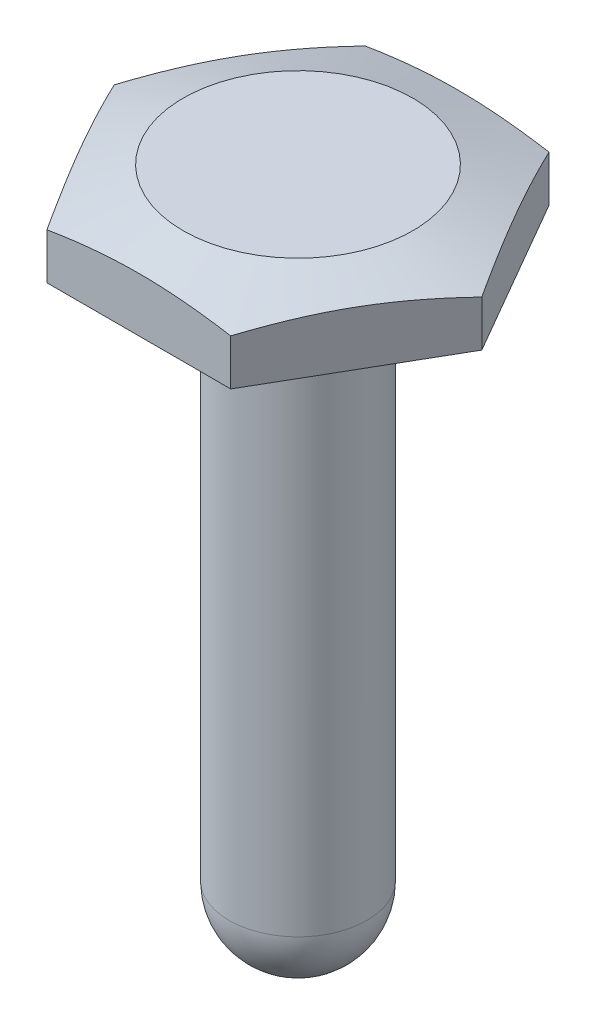
ISO-10303-21;
HEADER;
FILE_DESCRIPTION(('STEP AP214'),'2;1');
FILE_NAME('part.step','',(''),(''),'','','');
FILE_SCHEMA(('AUTOMOTIVE_DESIGN { 1 0 10303 214 1 1 1 1 }'));
ENDSEC;
DATA;
#1=APPLICATION_CONTEXT('core data for automotive mechanical design processes');
#2=APPLICATION_PROTOCOL_DEFINITION('international standard','automotive_design',2000,#1);
#3=PRODUCT_CONTEXT('',#1,'mechanical');
#4=PRODUCT('Part','Part','',(#3));
#5=PRODUCT_RELATED_PRODUCT_CATEGORY('part','',(#4));
#6=PRODUCT_DEFINITION_FORMATION('','',#4);
#7=PRODUCT_DEFINITION_CONTEXT('part definition',#1,'design');
#8=PRODUCT_DEFINITION('design','',#6,#7);
#9=PRODUCT_DEFINITION_SHAPE('','',#8);
#10=(LENGTH_UNIT() NAMED_UNIT(*) SI_UNIT(.MILLI.,.METRE.));
#11=(NAMED_UNIT(*) PLANE_ANGLE_UNIT() SI_UNIT($,.RADIAN.));
#12=(NAMED_UNIT(*) SI_UNIT($,.STERADIAN.) SOLID_ANGLE_UNIT());
#13=UNCERTAINTY_MEASURE_WITH_UNIT(LENGTH_MEASURE(1.E-05),#10,'distance_accuracy_value','');
#14=(GEOMETRIC_REPRESENTATION_CONTEXT(3) GLOBAL_UNCERTAINTY_ASSIGNED_CONTEXT((#13)) GLOBAL_UNIT_ASSIGNED_CONTEXT((#10,
#11,#12)) REPRESENTATION_CONTEXT('',''));
#15=CARTESIAN_POINT('',(0.,0.,0.));
#16=DIRECTION('',(0.,0.,1.));
#17=DIRECTION('',(1.,0.,0.));
#18=AXIS2_PLACEMENT_3D('',#15,#16,#17);
#19=CARTESIAN_POINT('',(9.52500000000007,-9.525,0.));
#20=DIRECTION('',(0.,1.,0.));
#21=DIRECTION('',(0.,0.,1.));
#22=AXIS2_PLACEMENT_3D('',#19,#20,#21);
#23=PLANE('',#22);
#24=CARTESIAN_POINT('',(0.,-9.525,0.));
#25=DIRECTION('',(0.,1.,0.));
#26=DIRECTION('',(0.,0.,1.));
#27=AXIS2_PLACEMENT_3D('',#24,#25,#26);
#28=CIRCLE('',#27,9.52500000000007);
#29=CARTESIAN_POINT('',(0.,-9.525,9.52500000000007));
#30=VERTEX_POINT('',#29);
#31=EDGE_CURVE('E141',#30,#30,#28,.T.);
#32=ORIENTED_EDGE('',*,*,#31,.T.);
#33=EDGE_LOOP('',(#32));
#34=FACE_BOUND('',#33,.T.);
#35=DIRECTION('',(0.5,0.,-0.866025403784439));
#36=VECTOR('',#35,1.);
#37=CARTESIAN_POINT('',(21.43125,-9.525,6.87407664253896));
#38=LINE('',#37,#36);
#39=CARTESIAN_POINT('',(12.7,-9.52500000000001,21.9970452561247));
#40=VERTEX_POINT('',#39);
#41=CARTESIAN_POINT('',(25.4,-9.525,0.));
#42=VERTEX_POINT('',#41);
#43=EDGE_CURVE('E134',#40,#42,#38,.T.);
#44=ORIENTED_EDGE('',*,*,#43,.F.);
#45=DIRECTION('',(1.,0.,0.));
#46=VECTOR('',#45,1.);
#47=CARTESIAN_POINT('',(9.52500000000007,-9.525,21.9970452561247));
#48=LINE('',#47,#46);
#49=CARTESIAN_POINT('',(-12.7,-9.52500000000001,21.9970452561247));
#50=VERTEX_POINT('',#49);
#51=EDGE_CURVE('E131',#50,#40,#48,.T.);
#52=ORIENTED_EDGE('',*,*,#51,.F.);
#53=DIRECTION('',(0.5,0.,0.866025403784439));
#54=VECTOR('',#53,1.);
#55=CARTESIAN_POINT('',(-16.66875,-9.525,15.1229686135858));
#56=LINE('',#55,#54);
#57=CARTESIAN_POINT('',(-25.4,-9.52500000000001,0.));
#58=VERTEX_POINT('',#57);
#59=EDGE_CURVE('E125',#58,#50,#56,.T.);
#60=ORIENTED_EDGE('',*,*,#59,.F.);
#61=DIRECTION('',(-0.5,0.,0.866025403784439));
#62=VECTOR('',#61,1.);
#63=CARTESIAN_POINT('',(-16.66875,-9.525,-15.1229686135858));
#64=LINE('',#63,#62);
#65=CARTESIAN_POINT('',(-12.7,-9.52500000000001,-21.9970452561247));
#66=VERTEX_POINT('',#65);
#67=EDGE_CURVE('E121',#66,#58,#64,.T.);
#68=ORIENTED_EDGE('',*,*,#67,.F.);
#69=DIRECTION('',(-1.,0.,0.));
#70=VECTOR('',#69,1.);
#71=CARTESIAN_POINT('',(9.52500000000007,-9.525,-21.9970452561247));
#72=LINE('',#71,#70);
#73=CARTESIAN_POINT('',(12.7,-9.52500000000001,-21.9970452561247));
#74=VERTEX_POINT('',#73);
#75=EDGE_CURVE('E106',#74,#66,#72,.T.);
#76=ORIENTED_EDGE('',*,*,#75,.F.);
#77=DIRECTION('',(-0.5,0.,-0.866025403784438));
#78=VECTOR('',#77,1.);
#79=CARTESIAN_POINT('',(21.43125,-9.525,-6.87407664253896));
#80=LINE('',#79,#78);
#81=EDGE_CURVE('E100',#42,#74,#80,.T.);
#82=ORIENTED_EDGE('',*,*,#81,.F.);
#83=EDGE_LOOP('',(#44,#52,#60,#68,#76,#82));
#84=FACE_BOUND('',#83,.T.);
#85=ADVANCED_FACE('F44',(#34,#84),#23,.F.);
#86=CARTESIAN_POINT('',(0.,-85.725,0.));
#87=DIRECTION('',(0.,1.,0.));
#88=DIRECTION('',(-1.,0.,0.));
#89=AXIS2_PLACEMENT_3D('',#86,#87,#88);
#90=SPHERICAL_SURFACE('',#89,9.525);
#91=CARTESIAN_POINT('',(0.,-85.725,0.));
#92=DIRECTION('',(0.,1.,0.));
#93=DIRECTION('',(0.,0.,1.));
#94=AXIS2_PLACEMENT_3D('',#91,#92,#93);
#95=CIRCLE('',#94,9.52500000000007);
#96=CARTESIAN_POINT('',(0.,-85.725,9.52500000000007));
#97=VERTEX_POINT('',#96);
#98=EDGE_CURVE('E145',#97,#97,#95,.T.);
#99=ORIENTED_EDGE('',*,*,#98,.F.);
#100=EDGE_LOOP('',(#99));
#101=FACE_BOUND('',#100,.T.);
#102=ADVANCED_FACE('F183',(#101),#90,.T.);
#103=CARTESIAN_POINT('',(0.,0.,0.));
#104=DIRECTION('',(0.,1.,0.));
#105=DIRECTION('',(0.,0.,1.));
#106=AXIS2_PLACEMENT_3D('',#103,#104,#105);
#107=CYLINDRICAL_SURFACE('',#106,9.52500000000007);
#108=ORIENTED_EDGE('',*,*,#31,.F.);
#109=EDGE_LOOP('',(#108));
#110=FACE_BOUND('',#109,.T.);
#111=ORIENTED_EDGE('',*,*,#98,.T.);
#112=EDGE_LOOP('',(#111));
#113=FACE_BOUND('',#112,.T.);
#114=ADVANCED_FACE('F174',(#110,#113),#107,.T.);
#115=CARTESIAN_POINT('',(12.7,-95.25,21.9970452561247));
#116=DIRECTION('',(0.866025403784439,0.,0.5));
#117=DIRECTION('',(0.5,0.,-0.866025403784439));
#118=AXIS2_PLACEMENT_3D('',#115,#116,#117);
#119=PLANE('',#118);
#120=ORIENTED_EDGE('',*,*,#43,.T.);
#121=DIRECTION('',(0.,1.,0.));
#122=VECTOR('',#121,1.);
#123=CARTESIAN_POINT('',(25.4,-95.25,0.));
#124=LINE('',#123,#122);
#125=CARTESIAN_POINT('',(25.4,-3.175,0.));
#126=VERTEX_POINT('',#125);
#127=EDGE_CURVE('E66',#42,#126,#124,.T.);
#128=ORIENTED_EDGE('',*,*,#127,.T.);
#129=CARTESIAN_POINT('',(25.4001154700538,-3.17503849028041,-0.000199999999997387));
#130=CARTESIAN_POINT('',(25.1368562649023,-3.0872913287684,0.455778318882641));
#131=CARTESIAN_POINT('',(24.8732704860666,-3.00351543960742,0.912322279978701));
#132=CARTESIAN_POINT('',(24.3454172361454,-2.84476326196486,1.82659092778261));
#133=CARTESIAN_POINT('',(24.0811497129611,-2.76978766766134,2.28431570472813));
#134=CARTESIAN_POINT('',(23.2870421118456,-2.5592869942159,3.65975041653684));
#135=CARTESIAN_POINT('',(22.7561974047889,-2.43829013567412,4.57920042008807));
#136=CARTESIAN_POINT('',(21.9604933898794,-2.29118213104087,5.95740020169796));
#137=CARTESIAN_POINT('',(21.6964032374505,-2.24798198811961,6.41481776348342));
#138=CARTESIAN_POINT('',(21.1678089575893,-2.1733908711785,7.3303699127932));
#139=CARTESIAN_POINT('',(20.9033048446129,-2.1419994936375,7.78850447527935));
#140=CARTESIAN_POINT('',(20.374076809069,-2.09156074710856,8.70515432163111));
#141=CARTESIAN_POINT('',(20.1093529695522,-2.07250989861226,9.16366946164903));
#142=CARTESIAN_POINT('',(19.5797527530954,-2.04707041728609,10.0809639442517));
#143=CARTESIAN_POINT('',(19.3148763765477,-2.04068175204158,10.539743286157));
#144=CARTESIAN_POINT('',(18.7851236234523,-2.04068175204158,11.4573019699677));
#145=CARTESIAN_POINT('',(18.5202472469046,-2.04707041728609,11.9160813118731));
#146=CARTESIAN_POINT('',(17.9906470304478,-2.07250989861226,12.8333757944757));
#147=CARTESIAN_POINT('',(17.725923190931,-2.09156074710856,13.2918909344936));
#148=CARTESIAN_POINT('',(17.1966951553871,-2.1419994936375,14.2085407808454));
#149=CARTESIAN_POINT('',(16.9321910424107,-2.1733908711785,14.6666753433315));
#150=CARTESIAN_POINT('',(16.4035967625495,-2.24798198811961,15.5822274926413));
#151=CARTESIAN_POINT('',(16.1395066101206,-2.29118213104087,16.0396450544268));
#152=CARTESIAN_POINT('',(15.3438025952111,-2.43829013567412,17.4178448360367));
#153=CARTESIAN_POINT('',(14.8129578881544,-2.5592869942159,18.3372948395879));
#154=CARTESIAN_POINT('',(14.0188502870389,-2.76978766766134,19.7127295513966));
#155=CARTESIAN_POINT('',(13.7545827638546,-2.84476326196486,20.1704543283421));
#156=CARTESIAN_POINT('',(13.2267295139334,-3.00351543960742,21.084722976146));
#157=CARTESIAN_POINT('',(12.9631437350977,-3.0872913287684,21.5412669372421));
#158=CARTESIAN_POINT('',(12.6998845299462,-3.17503849028041,21.9972452561247));
#159=B_SPLINE_CURVE_WITH_KNOTS('',3,(#129,#130,#131,#132,#133,#134,#135,#136,#137,#138,#139,
#140,#141,#142,#143,#144,#145,#146,#147,#148,#149,#150,#151,#152,#153,#154,#155,#156,#157,#158),
.UNSPECIFIED.,.F.,.F.,(4,2,2,2,2,2,2,2,2,2,2,2,2,2,4),(0.,1.60130008237788,3.2027263925052,
6.40740635069926,7.99713308911825,9.58680549953178,11.1760294940916,12.7652494203022,
14.3544693465127,15.9436933410725,17.5333657514861,19.123092489905,22.3277724480991,
23.9291987582264,25.5304988406043),.UNSPECIFIED.);
#160=CARTESIAN_POINT('',(12.7,-3.175,21.9970452561247));
#161=VERTEX_POINT('',#160);
#162=EDGE_CURVE('E12',#126,#161,#159,.T.);
#163=ORIENTED_EDGE('',*,*,#162,.T.);
#164=DIRECTION('',(0.,1.,0.));
#165=VECTOR('',#164,1.);
#166=CARTESIAN_POINT('',(12.7,-95.25,21.9970452561247));
#167=LINE('',#166,#165);
#168=EDGE_CURVE('E107',#40,#161,#167,.T.);
#169=ORIENTED_EDGE('',*,*,#168,.F.);
#170=EDGE_LOOP('',(#120,#128,#163,#169));
#171=FACE_BOUND('',#170,.T.);
#172=ADVANCED_FACE('F170',(#171),#119,.T.);
#173=CARTESIAN_POINT('',(-12.7,-95.25,21.9970452561247));
#174=DIRECTION('',(0.,0.,1.));
#175=DIRECTION('',(1.,0.,0.));
#176=AXIS2_PLACEMENT_3D('',#173,#174,#175);
#177=PLANE('',#176);
#178=ORIENTED_EDGE('',*,*,#51,.T.);
#179=ORIENTED_EDGE('',*,*,#168,.T.);
#180=CARTESIAN_POINT('',(38.2978683508479,-9.43018678027433,21.9970452561247));
#181=CARTESIAN_POINT('',(37.366954446028,-9.16114723012989,21.9970452561247));
#182=CARTESIAN_POINT('',(36.4354054698626,-8.89428263096763,21.9970452561247));
#183=CARTESIAN_POINT('',(34.570766140768,-8.36590793195759,21.9970452561247));
#184=CARTESIAN_POINT('',(33.6376757499567,-8.10439796588751,21.9970452561247));
#185=CARTESIAN_POINT('',(31.7694417135726,-7.58767125656107,21.9970452561247));
#186=CARTESIAN_POINT('',(30.8342975250424,-7.33245647237417,21.9970452561247));
#187=CARTESIAN_POINT('',(28.9619399416782,-6.82973732138097,21.9970452561247));
#188=CARTESIAN_POINT('',(28.0247265572278,-6.5822329159763,21.9970452561247));
#189=CARTESIAN_POINT('',(26.1343112374944,-6.0930792131876,21.9970452561247));
#190=CARTESIAN_POINT('',(25.1810739435313,-5.85156618217118,21.9970452561247));
#191=CARTESIAN_POINT('',(23.2716684198158,-5.38035570374151,21.9970452561247));
#192=CARTESIAN_POINT('',(22.3155001770607,-5.15065830882682,21.9970452561247));
#193=CARTESIAN_POINT('',(20.3995985687122,-4.70578347297172,21.9970452561247));
#194=CARTESIAN_POINT('',(19.4398646046469,-4.49060859750058,21.9970452561247));
#195=CARTESIAN_POINT('',(17.5165183701394,-4.07823880539323,21.9970452561247));
#196=CARTESIAN_POINT('',(16.5529061075321,-3.88104385245313,21.9970452561247));
#197=CARTESIAN_POINT('',(14.6606963079455,-3.5163777410803,21.9970452561247));
#198=CARTESIAN_POINT('',(13.732270198692,-3.34802337716021,21.9970452561247));
#199=CARTESIAN_POINT('',(11.8712391455674,-3.0359965524344,21.9970452561247));
#200=CARTESIAN_POINT('',(10.9386342031952,-2.89232408277724,21.9970452561247));
#201=CARTESIAN_POINT('',(9.0697522509864,-2.63443440999201,21.9970452561247));
#202=CARTESIAN_POINT('',(8.13347714635197,-2.5202035668261,21.9970452561247));
#203=CARTESIAN_POINT('',(6.25736787790616,-2.32578734686945,21.9970452561247));
#204=CARTESIAN_POINT('',(5.31753379809013,-2.24560117158126,21.9970452561247));
#205=CARTESIAN_POINT('',(3.44166070609843,-2.12359572466948,21.9970452561247));
#206=CARTESIAN_POINT('',(2.50563844811313,-2.08152302829441,21.9970452561247));
#207=CARTESIAN_POINT('',(0.632639422870756,-2.03710415764205,21.9970452561247));
#208=CARTESIAN_POINT('',(-0.304337338287472,-2.03475773110452,21.9970452561247));
#209=CARTESIAN_POINT('',(-2.17767826259224,-2.06992521958852,21.9970452561247));
#210=CARTESIAN_POINT('',(-3.11404230145292,-2.10744561183136,21.9970452561247));
#211=CARTESIAN_POINT('',(-4.98445913479629,-2.22031210036118,21.9970452561247));
#212=CARTESIAN_POINT('',(-5.91851192826693,-2.29565821320835,21.9970452561247));
#213=CARTESIAN_POINT('',(-7.50860972863141,-2.45325306589533,21.9970452561247));
#214=CARTESIAN_POINT('',(-8.1655261893116,-2.52693585185173,21.9970452561247));
#215=CARTESIAN_POINT('',(-9.47740727682041,-2.68970655765212,21.9970452561247));
#216=CARTESIAN_POINT('',(-10.1323719866191,-2.77879381285834,21.9970452561247));
#217=CARTESIAN_POINT('',(-12.0940944371739,-3.06667409413572,21.9970452561247));
#218=CARTESIAN_POINT('',(-13.3978493418652,-3.28610319992141,21.9970452561247));
#219=CARTESIAN_POINT('',(-15.3505278038922,-3.64772557242004,21.9970452561247));
#220=CARTESIAN_POINT('',(-16.0025019847754,-3.77402470233867,21.9970452561247));
#221=CARTESIAN_POINT('',(-17.3045720728078,-4.03600182379453,21.9970452561247));
#222=CARTESIAN_POINT('',(-17.9546679859193,-4.17167978552482,21.9970452561247));
#223=CARTESIAN_POINT('',(-19.2530861244948,-4.45116923630007,21.9970452561247));
#224=CARTESIAN_POINT('',(-19.9014083845156,-4.59498056567828,21.9970452561247));
#225=CARTESIAN_POINT('',(-21.1964500005815,-4.88966491700774,21.9970452561247));
#226=CARTESIAN_POINT('',(-21.8431693410121,-5.04053800746738,21.9970452561247));
#227=CARTESIAN_POINT('',(-23.1553223519192,-5.3532168249874,21.9970452561247));
#228=CARTESIAN_POINT('',(-23.8207096400034,-5.51521683518905,21.9970452561247));
#229=CARTESIAN_POINT('',(-25.1500867986151,-5.84485912760692,21.9970452561247));
#230=CARTESIAN_POINT('',(-25.8140766589831,-6.01250145069373,21.9970452561247));
#231=CARTESIAN_POINT('',(-27.8041798316898,-6.52273756253639,21.9970452561247));
#232=CARTESIAN_POINT('',(-29.128422328909,-6.87263943276859,21.9970452561247));
#233=CARTESIAN_POINT('',(-31.1063344789276,-7.40709912856073,21.9970452561247));
#234=CARTESIAN_POINT('',(-31.7615226451943,-7.5860895358468,21.9970452561247));
#235=CARTESIAN_POINT('',(-33.0710170527472,-7.94727720245181,21.9970452561247));
#236=CARTESIAN_POINT('',(-33.7253232927207,-8.12947446653824,21.9970452561247));
#237=CARTESIAN_POINT('',(-35.0330794980826,-8.49666349655702,21.9970452561247));
#238=CARTESIAN_POINT('',(-35.6865295423757,-8.68165498191825,21.9970452561247));
#239=CARTESIAN_POINT('',(-36.9927143425478,-9.05413065189059,21.9970452561247));
#240=CARTESIAN_POINT('',(-37.6454491031381,-9.24161481997544,21.9970452561247));
#241=CARTESIAN_POINT('',(-38.2978683508479,-9.43018678027433,21.9970452561247));
#242=B_SPLINE_CURVE_WITH_KNOTS('',3,(#180,#181,#182,#183,#184,#185,#186,#187,#188,#189,#190,
#191,#192,#193,#194,#195,#196,#197,#198,#199,#200,#201,#202,#203,#204,#205,#206,#207,#208,#209,
#210,#211,#212,#213,#214,#215,#216,#217,#218,#219,#220,#221,#222,#223,#224,#225,#226,#227,#228,
#229,#230,#231,#232,#233,#234,#235,#236,#237,#238,#239,#240,#241),.UNSPECIFIED.,.F.,.F.,(4,2,2,
2,2,2,2,2,2,2,2,2,2,2,2,2,2,2,2,2,2,2,2,2,2,2,2,2,2,2,4),(0.,2.90704069307795,5.81415392593051,
8.72216072497131,11.6301529641093,14.5801613357166,17.5301828135015,20.4807240693313,
23.43125936749,26.2616866158578,29.0921128491729,31.9212254050207,34.7502716020497,
37.5603657647112,40.3704420833796,43.1809750291471,45.9915092053745,47.9744318829263,
49.9572690270767,53.922434494936,55.9146802895544,57.9069197528939,59.8991201199987,
61.8913398180826,63.9457836311217,66.0002423289037,70.1091733210494,72.1467614182709,
74.1843525449374,76.2217404170812,78.2591147882679),.UNSPECIFIED.);
#243=CARTESIAN_POINT('',(-12.7,-3.175,21.9970452561247));
#244=VERTEX_POINT('',#243);
#245=EDGE_CURVE('E59',#161,#244,#242,.T.);
#246=ORIENTED_EDGE('',*,*,#245,.T.);
#247=DIRECTION('',(0.,1.,0.));
#248=VECTOR('',#247,1.);
#249=CARTESIAN_POINT('',(-12.7,-95.25,21.9970452561247));
#250=LINE('',#249,#248);
#251=EDGE_CURVE('E301',#50,#244,#250,.T.);
#252=ORIENTED_EDGE('',*,*,#251,.F.);
#253=EDGE_LOOP('',(#178,#179,#246,#252));
#254=FACE_BOUND('',#253,.T.);
#255=ADVANCED_FACE('F173',(#254),#177,.T.);
#256=CARTESIAN_POINT('',(-25.4,-95.25,0.));
#257=DIRECTION('',(-0.866025403784439,0.,0.5));
#258=DIRECTION('',(0.5,0.,0.866025403784439));
#259=AXIS2_PLACEMENT_3D('',#256,#257,#258);
#260=PLANE('',#259);
#261=ORIENTED_EDGE('',*,*,#59,.T.);
#262=ORIENTED_EDGE('',*,*,#251,.T.);
#263=CARTESIAN_POINT('',(-12.6998845299462,-3.17503849028041,21.9972452561247));
#264=CARTESIAN_POINT('',(-12.9631437350977,-3.0872913287684,21.5412669372421));
#265=CARTESIAN_POINT('',(-13.2267295139334,-3.00351543960742,21.084722976146));
#266=CARTESIAN_POINT('',(-13.7545827638546,-2.84476326196486,20.1704543283421));
#267=CARTESIAN_POINT('',(-14.0188502870389,-2.76978766766134,19.7127295513966));
#268=CARTESIAN_POINT('',(-14.8129578881544,-2.5592869942159,18.3372948395879));
#269=CARTESIAN_POINT('',(-15.3438025952111,-2.43829013567412,17.4178448360367));
#270=CARTESIAN_POINT('',(-16.1395066101206,-2.29118213104087,16.0396450544268));
#271=CARTESIAN_POINT('',(-16.4035967625495,-2.24798198811961,15.5822274926413));
#272=CARTESIAN_POINT('',(-16.9321910424107,-2.1733908711785,14.6666753433315));
#273=CARTESIAN_POINT('',(-17.1966951553871,-2.14199949363749,14.2085407808454));
#274=CARTESIAN_POINT('',(-17.725923190931,-2.09156074710856,13.2918909344936));
#275=CARTESIAN_POINT('',(-17.9906470304478,-2.07250989861226,12.8333757944757));
#276=CARTESIAN_POINT('',(-18.5202472469046,-2.04707041728609,11.9160813118731));
#277=CARTESIAN_POINT('',(-18.7851236234523,-2.04068175204158,11.4573019699677));
#278=CARTESIAN_POINT('',(-19.3148763765477,-2.04068175204158,10.539743286157));
#279=CARTESIAN_POINT('',(-19.5797527530954,-2.04707041728609,10.0809639442517));
#280=CARTESIAN_POINT('',(-20.1093529695522,-2.07250989861226,9.16366946164903));
#281=CARTESIAN_POINT('',(-20.374076809069,-2.09156074710856,8.7051543216311));
#282=CARTESIAN_POINT('',(-20.9033048446129,-2.1419994936375,7.78850447527935));
#283=CARTESIAN_POINT('',(-21.1678089575893,-2.1733908711785,7.33036991279319));
#284=CARTESIAN_POINT('',(-21.6964032374505,-2.24798198811961,6.41481776348342));
#285=CARTESIAN_POINT('',(-21.9604933898794,-2.29118213104087,5.95740020169795));
#286=CARTESIAN_POINT('',(-22.7561974047889,-2.43829013567412,4.57920042008806));
#287=CARTESIAN_POINT('',(-23.2870421118456,-2.5592869942159,3.65975041653684));
#288=CARTESIAN_POINT('',(-24.0811497129611,-2.76978766766134,2.28431570472812));
#289=CARTESIAN_POINT('',(-24.3454172361454,-2.84476326196486,1.8265909277826));
#290=CARTESIAN_POINT('',(-24.8732704860666,-3.00351543960742,0.912322279978691));
#291=CARTESIAN_POINT('',(-25.1368562649023,-3.0872913287684,0.455778318882629));
#292=CARTESIAN_POINT('',(-25.4001154700538,-3.17503849028041,-0.000200000000010062));
#293=B_SPLINE_CURVE_WITH_KNOTS('',3,(#263,#264,#265,#266,#267,#268,#269,#270,#271,#272,#273,
#274,#275,#276,#277,#278,#279,#280,#281,#282,#283,#284,#285,#286,#287,#288,#289,#290,#291,#292),
.UNSPECIFIED.,.F.,.F.,(4,2,2,2,2,2,2,2,2,2,2,2,2,2,4),(0.,1.60130008237787,3.2027263925052,
6.40740635069926,7.99713308911826,9.58680549953178,11.1760294940916,12.7652494203022,
14.3544693465128,15.9436933410725,17.5333657514861,19.1230924899051,22.3277724480991,
23.9291987582264,25.5304988406043),.UNSPECIFIED.);
#294=CARTESIAN_POINT('',(-25.4,-3.175,0.));
#295=VERTEX_POINT('',#294);
#296=EDGE_CURVE('E316',#244,#295,#293,.T.);
#297=ORIENTED_EDGE('',*,*,#296,.T.);
#298=DIRECTION('',(0.,1.,0.));
#299=VECTOR('',#298,1.);
#300=CARTESIAN_POINT('',(-25.4,-95.25,0.));
#301=LINE('',#300,#299);
#302=EDGE_CURVE('E304',#58,#295,#301,.T.);
#303=ORIENTED_EDGE('',*,*,#302,.F.);
#304=EDGE_LOOP('',(#261,#262,#297,#303));
#305=FACE_BOUND('',#304,.T.);
#306=ADVANCED_FACE('F180',(#305),#260,.T.);
#307=CARTESIAN_POINT('',(-12.7,-95.25,-21.9970452561247));
#308=DIRECTION('',(-0.866025403784439,0.,-0.5));
#309=DIRECTION('',(-0.5,0.,0.866025403784439));
#310=AXIS2_PLACEMENT_3D('',#307,#308,#309);
#311=PLANE('',#310);
#312=ORIENTED_EDGE('',*,*,#67,.T.);
#313=ORIENTED_EDGE('',*,*,#302,.T.);
#314=CARTESIAN_POINT('',(-25.4001154700538,-3.17503849028041,0.000199999999993958));
#315=CARTESIAN_POINT('',(-25.1368562649023,-3.0872913287684,-0.455778318882644));
#316=CARTESIAN_POINT('',(-24.8732704860666,-3.00351543960742,-0.912322279978704));
#317=CARTESIAN_POINT('',(-24.3454172361454,-2.84476326196486,-1.82659092778262));
#318=CARTESIAN_POINT('',(-24.0811497129611,-2.76978766766134,-2.28431570472813));
#319=CARTESIAN_POINT('',(-23.2870421118456,-2.5592869942159,-3.65975041653685));
#320=CARTESIAN_POINT('',(-22.7561974047889,-2.43829013567412,-4.57920042008807));
#321=CARTESIAN_POINT('',(-21.9604933898794,-2.29118213104087,-5.95740020169796));
#322=CARTESIAN_POINT('',(-21.6964032374505,-2.24798198811961,-6.41481776348342));
#323=CARTESIAN_POINT('',(-21.1678089575893,-2.1733908711785,-7.3303699127932));
#324=CARTESIAN_POINT('',(-20.9033048446129,-2.1419994936375,-7.78850447527936));
#325=CARTESIAN_POINT('',(-20.374076809069,-2.09156074710856,-8.70515432163111));
#326=CARTESIAN_POINT('',(-20.1093529695522,-2.07250989861226,-9.16366946164904));
#327=CARTESIAN_POINT('',(-19.5797527530954,-2.04707041728609,-10.0809639442517));
#328=CARTESIAN_POINT('',(-19.3148763765477,-2.04068175204158,-10.539743286157));
#329=CARTESIAN_POINT('',(-18.7851236234523,-2.04068175204158,-11.4573019699677));
#330=CARTESIAN_POINT('',(-18.5202472469046,-2.04707041728609,-11.9160813118731));
#331=CARTESIAN_POINT('',(-17.9906470304478,-2.07250989861226,-12.8333757944757));
#332=CARTESIAN_POINT('',(-17.725923190931,-2.09156074710856,-13.2918909344936));
#333=CARTESIAN_POINT('',(-17.1966951553871,-2.1419994936375,-14.2085407808454));
#334=CARTESIAN_POINT('',(-16.9321910424107,-2.1733908711785,-14.6666753433315));
#335=CARTESIAN_POINT('',(-16.4035967625495,-2.24798198811961,-15.5822274926413));
#336=CARTESIAN_POINT('',(-16.1395066101206,-2.29118213104087,-16.0396450544268));
#337=CARTESIAN_POINT('',(-15.3438025952111,-2.43829013567412,-17.4178448360367));
#338=CARTESIAN_POINT('',(-14.8129578881544,-2.5592869942159,-18.3372948395879));
#339=CARTESIAN_POINT('',(-14.0188502870389,-2.76978766766134,-19.7127295513966));
#340=CARTESIAN_POINT('',(-13.7545827638546,-2.84476326196486,-20.1704543283421));
#341=CARTESIAN_POINT('',(-13.2267295139334,-3.00351543960742,-21.084722976146));
#342=CARTESIAN_POINT('',(-12.9631437350977,-3.0872913287684,-21.5412669372421));
#343=CARTESIAN_POINT('',(-12.6998845299462,-3.17503849028041,-21.9972452561247));
#344=B_SPLINE_CURVE_WITH_KNOTS('',3,(#314,#315,#316,#317,#318,#319,#320,#321,#322,#323,#324,
#325,#326,#327,#328,#329,#330,#331,#332,#333,#334,#335,#336,#337,#338,#339,#340,#341,#342,#343),
.UNSPECIFIED.,.F.,.F.,(4,2,2,2,2,2,2,2,2,2,2,2,2,2,4),(0.,1.60130008237788,3.2027263925052,
6.40740635069926,7.99713308911825,9.58680549953178,11.1760294940916,12.7652494203022,
14.3544693465128,15.9436933410725,17.5333657514861,19.1230924899051,22.3277724480991,
23.9291987582264,25.5304988406043),.UNSPECIFIED.);
#345=CARTESIAN_POINT('',(-12.7,-3.175,-21.9970452561247));
#346=VERTEX_POINT('',#345);
#347=EDGE_CURVE('E313',#295,#346,#344,.T.);
#348=ORIENTED_EDGE('',*,*,#347,.T.);
#349=DIRECTION('',(0.,1.,0.));
#350=VECTOR('',#349,1.);
#351=CARTESIAN_POINT('',(-12.7,-95.25,-21.9970452561247));
#352=LINE('',#351,#350);
#353=EDGE_CURVE('E117',#66,#346,#352,.T.);
#354=ORIENTED_EDGE('',*,*,#353,.F.);
#355=EDGE_LOOP('',(#312,#313,#348,#354));
#356=FACE_BOUND('',#355,.T.);
#357=ADVANCED_FACE('F230',(#356),#311,.T.);
#358=CARTESIAN_POINT('',(12.7,-95.25,-21.9970452561247));
#359=DIRECTION('',(0.,0.,-1.));
#360=DIRECTION('',(-1.,0.,0.));
#361=AXIS2_PLACEMENT_3D('',#358,#359,#360);
#362=PLANE('',#361);
#363=ORIENTED_EDGE('',*,*,#75,.T.);
#364=ORIENTED_EDGE('',*,*,#353,.T.);
#365=CARTESIAN_POINT('',(-38.2978683508479,-9.43018678027433,-21.9970452561247));
#366=CARTESIAN_POINT('',(-37.366954446028,-9.16114723012989,-21.9970452561247));
#367=CARTESIAN_POINT('',(-36.4354054698626,-8.89428263096763,-21.9970452561247));
#368=CARTESIAN_POINT('',(-34.570766140768,-8.36590793195759,-21.9970452561247));
#369=CARTESIAN_POINT('',(-33.6376757499567,-8.10439796588751,-21.9970452561247));
#370=CARTESIAN_POINT('',(-31.7694417135726,-7.58767125656107,-21.9970452561247));
#371=CARTESIAN_POINT('',(-30.8342975250424,-7.33245647237417,-21.9970452561247));
#372=CARTESIAN_POINT('',(-28.9619399416782,-6.82973732138098,-21.9970452561247));
#373=CARTESIAN_POINT('',(-28.0247265572279,-6.5822329159763,-21.9970452561247));
#374=CARTESIAN_POINT('',(-26.1343112374944,-6.0930792131876,-21.9970452561247));
#375=CARTESIAN_POINT('',(-25.1810739435313,-5.85156618217119,-21.9970452561247));
#376=CARTESIAN_POINT('',(-23.2716684198158,-5.38035570374152,-21.9970452561247));
#377=CARTESIAN_POINT('',(-22.3155001770607,-5.15065830882683,-21.9970452561247));
#378=CARTESIAN_POINT('',(-20.3995985687122,-4.70578347297172,-21.9970452561247));
#379=CARTESIAN_POINT('',(-19.4398646046469,-4.49060859750058,-21.9970452561247));
#380=CARTESIAN_POINT('',(-17.5165183701394,-4.07823880539323,-21.9970452561247));
#381=CARTESIAN_POINT('',(-16.5529061075321,-3.88104385245313,-21.9970452561247));
#382=CARTESIAN_POINT('',(-14.6606963079455,-3.5163777410803,-21.9970452561247));
#383=CARTESIAN_POINT('',(-13.732270198692,-3.34802337716021,-21.9970452561247));
#384=CARTESIAN_POINT('',(-11.8712391455674,-3.0359965524344,-21.9970452561247));
#385=CARTESIAN_POINT('',(-10.9386342031952,-2.89232408277724,-21.9970452561247));
#386=CARTESIAN_POINT('',(-9.0697522509864,-2.63443440999201,-21.9970452561247));
#387=CARTESIAN_POINT('',(-8.13347714635197,-2.5202035668261,-21.9970452561247));
#388=CARTESIAN_POINT('',(-6.25736787790616,-2.32578734686945,-21.9970452561247));
#389=CARTESIAN_POINT('',(-5.31753379809013,-2.24560117158126,-21.9970452561247));
#390=CARTESIAN_POINT('',(-3.44166070609843,-2.12359572466948,-21.9970452561247));
#391=CARTESIAN_POINT('',(-2.50563844811313,-2.08152302829441,-21.9970452561247));
#392=CARTESIAN_POINT('',(-0.632639422870753,-2.03710415764205,-21.9970452561247));
#393=CARTESIAN_POINT('',(0.304337338287473,-2.03475773110452,-21.9970452561247));
#394=CARTESIAN_POINT('',(2.17767826259223,-2.06992521958852,-21.9970452561247));
#395=CARTESIAN_POINT('',(3.11404230145291,-2.10744561183136,-21.9970452561247));
#396=CARTESIAN_POINT('',(4.98445913479628,-2.22031210036118,-21.9970452561247));
#397=CARTESIAN_POINT('',(5.91851192826692,-2.29565821320835,-21.9970452561247));
#398=CARTESIAN_POINT('',(7.5086097286314,-2.45325306589533,-21.9970452561247));
#399=CARTESIAN_POINT('',(8.1655261893116,-2.52693585185173,-21.9970452561247));
#400=CARTESIAN_POINT('',(9.47740727682041,-2.68970655765213,-21.9970452561247));
#401=CARTESIAN_POINT('',(10.1323719866191,-2.77879381285834,-21.9970452561247));
#402=CARTESIAN_POINT('',(12.0940944371739,-3.06667409413572,-21.9970452561247));
#403=CARTESIAN_POINT('',(13.3978493418652,-3.2861031999214,-21.9970452561247));
#404=CARTESIAN_POINT('',(15.3505278038922,-3.64772557242004,-21.9970452561247));
#405=CARTESIAN_POINT('',(16.0025019847754,-3.77402470233868,-21.9970452561247));
#406=CARTESIAN_POINT('',(17.3045720728078,-4.03600182379454,-21.9970452561247));
#407=CARTESIAN_POINT('',(17.9546679859193,-4.17167978552482,-21.9970452561247));
#408=CARTESIAN_POINT('',(19.2530861244948,-4.45116923630007,-21.9970452561247));
#409=CARTESIAN_POINT('',(19.9014083845156,-4.59498056567828,-21.9970452561247));
#410=CARTESIAN_POINT('',(21.1964500005815,-4.88966491700774,-21.9970452561247));
#411=CARTESIAN_POINT('',(21.8431693410121,-5.04053800746738,-21.9970452561247));
#412=CARTESIAN_POINT('',(23.1553223519192,-5.3532168249874,-21.9970452561247));
#413=CARTESIAN_POINT('',(23.8207096400034,-5.51521683518905,-21.9970452561247));
#414=CARTESIAN_POINT('',(25.1500867986151,-5.84485912760692,-21.9970452561247));
#415=CARTESIAN_POINT('',(25.8140766589831,-6.01250145069373,-21.9970452561247));
#416=CARTESIAN_POINT('',(27.8041798316898,-6.52273756253639,-21.9970452561247));
#417=CARTESIAN_POINT('',(29.128422328909,-6.8726394327686,-21.9970452561247));
#418=CARTESIAN_POINT('',(31.1063344789276,-7.40709912856073,-21.9970452561247));
#419=CARTESIAN_POINT('',(31.7615226451943,-7.5860895358468,-21.9970452561247));
#420=CARTESIAN_POINT('',(33.0710170527471,-7.94727720245181,-21.9970452561247));
#421=CARTESIAN_POINT('',(33.7253232927207,-8.12947446653823,-21.9970452561247));
#422=CARTESIAN_POINT('',(35.0330794980826,-8.49666349655701,-21.9970452561247));
#423=CARTESIAN_POINT('',(35.6865295423757,-8.68165498191825,-21.9970452561247));
#424=CARTESIAN_POINT('',(36.9927143425478,-9.05413065189059,-21.9970452561247));
#425=CARTESIAN_POINT('',(37.6454491031381,-9.24161481997544,-21.9970452561247));
#426=CARTESIAN_POINT('',(38.2978683508479,-9.43018678027433,-21.9970452561247));
#427=B_SPLINE_CURVE_WITH_KNOTS('',3,(#365,#366,#367,#368,#369,#370,#371,#372,#373,#374,#375,
#376,#377,#378,#379,#380,#381,#382,#383,#384,#385,#386,#387,#388,#389,#390,#391,#392,#393,#394,
#395,#396,#397,#398,#399,#400,#401,#402,#403,#404,#405,#406,#407,#408,#409,#410,#411,#412,#413,
#414,#415,#416,#417,#418,#419,#420,#421,#422,#423,#424,#425,#426),.UNSPECIFIED.,.F.,.F.,(4,2,2,
2,2,2,2,2,2,2,2,2,2,2,2,2,2,2,2,2,2,2,2,2,2,2,2,2,2,2,4),(0.,2.90704069307795,5.81415392593051,
8.72216072497131,11.6301529641093,14.5801613357166,17.5301828135015,20.4807240693313,
23.43125936749,26.2616866158578,29.0921128491729,31.9212254050207,34.7502716020497,
37.5603657647112,40.3704420833796,43.1809750291471,45.9915092053745,47.9744318829263,
49.9572690270767,53.922434494936,55.9146802895544,57.9069197528939,59.8991201199987,
61.8913398180826,63.9457836311217,66.0002423289037,70.1091733210494,72.1467614182709,
74.1843525449374,76.2217404170812,78.2591147882679),.UNSPECIFIED.);
#428=CARTESIAN_POINT('',(12.7,-3.175,-21.9970452561248));
#429=VERTEX_POINT('',#428);
#430=EDGE_CURVE('E114',#346,#429,#427,.T.);
#431=ORIENTED_EDGE('',*,*,#430,.T.);
#432=DIRECTION('',(0.,1.,0.));
#433=VECTOR('',#432,1.);
#434=CARTESIAN_POINT('',(12.7,-95.25,-21.9970452561247));
#435=LINE('',#434,#433);
#436=EDGE_CURVE('E71',#74,#429,#435,.T.);
#437=ORIENTED_EDGE('',*,*,#436,.F.);
#438=EDGE_LOOP('',(#363,#364,#431,#437));
#439=FACE_BOUND('',#438,.T.);
#440=ADVANCED_FACE('F110',(#439),#362,.T.);
#441=CARTESIAN_POINT('',(25.4,-95.25,0.));
#442=DIRECTION('',(0.866025403784438,0.,-0.5));
#443=DIRECTION('',(-0.5,0.,-0.866025403784438));
#444=AXIS2_PLACEMENT_3D('',#441,#442,#443);
#445=PLANE('',#444);
#446=ORIENTED_EDGE('',*,*,#81,.T.);
#447=ORIENTED_EDGE('',*,*,#436,.T.);
#448=CARTESIAN_POINT('',(12.6998845299461,-3.17503849028041,-21.9972452561247));
#449=CARTESIAN_POINT('',(12.9631437350977,-3.0872913287684,-21.5412669372421));
#450=CARTESIAN_POINT('',(13.2267295139334,-3.00351543960742,-21.084722976146));
#451=CARTESIAN_POINT('',(13.7545827638546,-2.84476326196486,-20.1704543283421));
#452=CARTESIAN_POINT('',(14.0188502870389,-2.76978766766134,-19.7127295513966));
#453=CARTESIAN_POINT('',(14.8129578881544,-2.5592869942159,-18.3372948395879));
#454=CARTESIAN_POINT('',(15.3438025952111,-2.43829013567411,-17.4178448360367));
#455=CARTESIAN_POINT('',(16.1395066101206,-2.29118213104087,-16.0396450544268));
#456=CARTESIAN_POINT('',(16.4035967625495,-2.2479819881196,-15.5822274926413));
#457=CARTESIAN_POINT('',(16.9321910424107,-2.1733908711785,-14.6666753433315));
#458=CARTESIAN_POINT('',(17.1966951553871,-2.14199949363749,-14.2085407808454));
#459=CARTESIAN_POINT('',(17.7259231909309,-2.09156074710856,-13.2918909344936));
#460=CARTESIAN_POINT('',(17.9906470304478,-2.07250989861226,-12.8333757944757));
#461=CARTESIAN_POINT('',(18.5202472469046,-2.04707041728609,-11.9160813118731));
#462=CARTESIAN_POINT('',(18.7851236234523,-2.04068175204158,-11.4573019699677));
#463=CARTESIAN_POINT('',(19.3148763765477,-2.04068175204158,-10.539743286157));
#464=CARTESIAN_POINT('',(19.5797527530954,-2.04707041728609,-10.0809639442517));
#465=CARTESIAN_POINT('',(20.1093529695522,-2.07250989861226,-9.16366946164903));
#466=CARTESIAN_POINT('',(20.374076809069,-2.09156074710856,-8.7051543216311));
#467=CARTESIAN_POINT('',(20.9033048446129,-2.14199949363749,-7.78850447527935));
#468=CARTESIAN_POINT('',(21.1678089575893,-2.1733908711785,-7.3303699127932));
#469=CARTESIAN_POINT('',(21.6964032374504,-2.2479819881196,-6.41481776348342));
#470=CARTESIAN_POINT('',(21.9604933898793,-2.29118213104087,-5.95740020169795));
#471=CARTESIAN_POINT('',(22.7561974047889,-2.43829013567412,-4.57920042008806));
#472=CARTESIAN_POINT('',(23.2870421118456,-2.5592869942159,-3.65975041653684));
#473=CARTESIAN_POINT('',(24.0811497129611,-2.76978766766134,-2.28431570472813));
#474=CARTESIAN_POINT('',(24.3454172361454,-2.84476326196486,-1.82659092778261));
#475=CARTESIAN_POINT('',(24.8732704860666,-3.00351543960742,-0.912322279978697));
#476=CARTESIAN_POINT('',(25.1368562649023,-3.0872913287684,-0.455778318882637));
#477=CARTESIAN_POINT('',(25.4001154700538,-3.17503849028041,0.000200000000001883));
#478=B_SPLINE_CURVE_WITH_KNOTS('',3,(#448,#449,#450,#451,#452,#453,#454,#455,#456,#457,#458,
#459,#460,#461,#462,#463,#464,#465,#466,#467,#468,#469,#470,#471,#472,#473,#474,#475,#476,#477),
.UNSPECIFIED.,.F.,.F.,(4,2,2,2,2,2,2,2,2,2,2,2,2,2,4),(0.,1.60130008237788,3.2027263925052,
6.40740635069927,7.99713308911826,9.58680549953178,11.1760294940916,12.7652494203022,
14.3544693465128,15.9436933410725,17.5333657514861,19.1230924899051,22.3277724480991,
23.9291987582265,25.5304988406043),.UNSPECIFIED.);
#479=EDGE_CURVE('E149',#429,#126,#478,.T.);
#480=ORIENTED_EDGE('',*,*,#479,.T.);
#481=ORIENTED_EDGE('',*,*,#127,.F.);
#482=EDGE_LOOP('',(#446,#447,#480,#481));
#483=FACE_BOUND('',#482,.T.);
#484=ADVANCED_FACE('F101',(#483),#445,.T.);
#485=CARTESIAN_POINT('',(15.875,0.,0.));
#486=DIRECTION('',(0.,-1.,0.));
#487=DIRECTION('',(0.,0.,-1.));
#488=AXIS2_PLACEMENT_3D('',#485,#486,#487);
#489=PLANE('',#488);
#490=CARTESIAN_POINT('',(0.,0.,0.));
#491=DIRECTION('',(0.,1.,0.));
#492=DIRECTION('',(0.,0.,1.));
#493=AXIS2_PLACEMENT_3D('',#490,#491,#492);
#494=CIRCLE('',#493,15.875);
#495=CARTESIAN_POINT('',(0.,0.,15.875));
#496=VERTEX_POINT('',#495);
#497=EDGE_CURVE('E137',#496,#496,#494,.T.);
#498=ORIENTED_EDGE('',*,*,#497,.T.);
#499=EDGE_LOOP('',(#498));
#500=FACE_BOUND('',#499,.T.);
#501=ADVANCED_FACE('F46',(#500),#489,.F.);
#502=CARTESIAN_POINT('',(0.,-3.175,0.));
#503=DIRECTION('',(0.,-1.,0.));
#504=DIRECTION('',(0.,0.,-1.));
#505=AXIS2_PLACEMENT_3D('',#502,#503,#504);
#506=CONICAL_SURFACE('',#505,25.4,1.24904577239825);
#507=ORIENTED_EDGE('',*,*,#497,.F.);
#508=EDGE_LOOP('',(#507));
#509=FACE_BOUND('',#508,.T.);
#510=ORIENTED_EDGE('',*,*,#162,.F.);
#511=ORIENTED_EDGE('',*,*,#479,.F.);
#512=ORIENTED_EDGE('',*,*,#430,.F.);
#513=ORIENTED_EDGE('',*,*,#347,.F.);
#514=ORIENTED_EDGE('',*,*,#296,.F.);
#515=ORIENTED_EDGE('',*,*,#245,.F.);
#516=EDGE_LOOP('',(#510,#511,#512,#513,#514,#515));
#517=FACE_BOUND('',#516,.T.);
#518=ADVANCED_FACE('F163',(#509,#517),#506,.T.);
#519=CLOSED_SHELL('',(#85,#102,#114,#172,#255,#306,#357,#440,#484,#501,#518));
#520=MANIFOLD_SOLID_BREP('B2',#519);
#521=ADVANCED_BREP_SHAPE_REPRESENTATION('',(#18,#520),#14);
#522=SHAPE_DEFINITION_REPRESENTATION(#9,#521);
ENDSEC;
END-ISO-10303-21;
